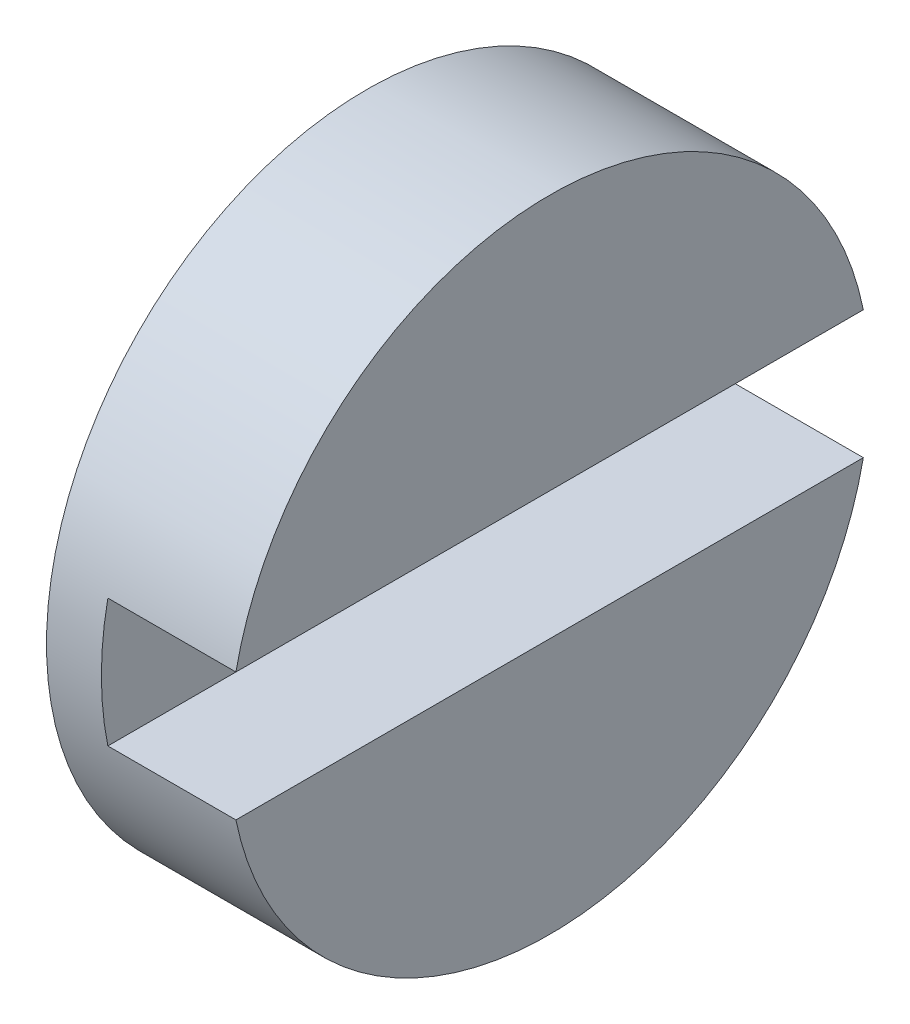
ISO-10303-21;
HEADER;
FILE_DESCRIPTION(('STEP AP214'),'2;1');
FILE_NAME('part.step','',(''),(''),'','','');
FILE_SCHEMA(('AUTOMOTIVE_DESIGN { 1 0 10303 214 1 1 1 1 }'));
ENDSEC;
DATA;
#1=APPLICATION_CONTEXT('core data for automotive mechanical design processes');
#2=APPLICATION_PROTOCOL_DEFINITION('international standard','automotive_design',2000,#1);
#3=PRODUCT_CONTEXT('',#1,'mechanical');
#4=PRODUCT('Part','Part','',(#3));
#5=PRODUCT_RELATED_PRODUCT_CATEGORY('part','',(#4));
#6=PRODUCT_DEFINITION_FORMATION('','',#4);
#7=PRODUCT_DEFINITION_CONTEXT('part definition',#1,'design');
#8=PRODUCT_DEFINITION('design','',#6,#7);
#9=PRODUCT_DEFINITION_SHAPE('','',#8);
#10=(LENGTH_UNIT() NAMED_UNIT(*) SI_UNIT(.MILLI.,.METRE.));
#11=(NAMED_UNIT(*) PLANE_ANGLE_UNIT() SI_UNIT($,.RADIAN.));
#12=(NAMED_UNIT(*) SI_UNIT($,.STERADIAN.) SOLID_ANGLE_UNIT());
#13=UNCERTAINTY_MEASURE_WITH_UNIT(LENGTH_MEASURE(1.E-05),#10,'distance_accuracy_value','');
#14=(GEOMETRIC_REPRESENTATION_CONTEXT(3) GLOBAL_UNCERTAINTY_ASSIGNED_CONTEXT((#13)) GLOBAL_UNIT_ASSIGNED_CONTEXT((#10,
#11,#12)) REPRESENTATION_CONTEXT('',''));
#15=CARTESIAN_POINT('',(0.,0.,0.));
#16=DIRECTION('',(0.,0.,1.));
#17=DIRECTION('',(1.,0.,0.));
#18=AXIS2_PLACEMENT_3D('',#15,#16,#17);
#19=CARTESIAN_POINT('',(6.53712741019333,0.,0.));
#20=DIRECTION('',(1.,0.,0.));
#21=DIRECTION('',(0.,0.,-1.));
#22=AXIS2_PLACEMENT_3D('',#19,#20,#21);
#23=PLANE('',#22);
#24=DIRECTION('',(0.,0.,1.));
#25=VECTOR('',#24,1.);
#26=CARTESIAN_POINT('',(6.53712741019333,79.3831456085717,5.8195900025507));
#27=LINE('',#26,#25);
#28=CARTESIAN_POINT('',(6.53712741019333,79.3831456085717,2.18535718005179));
#29=VERTEX_POINT('',#28);
#30=CARTESIAN_POINT('',(6.53712741019333,79.3831456085717,5.61464281994823));
#31=VERTEX_POINT('',#30);
#32=EDGE_CURVE('E81',#29,#31,#27,.T.);
#33=ORIENTED_EDGE('',*,*,#32,.T.);
#34=CARTESIAN_POINT('',(6.53712741019334,79.0331456085717,3.90000000000001));
#35=DIRECTION('',(1.,0.,0.));
#36=DIRECTION('',(0.,0.,-1.));
#37=AXIS2_PLACEMENT_3D('',#34,#35,#36);
#38=CIRCLE('',#37,1.75);
#39=CARTESIAN_POINT('',(6.53712741019334,78.6831456085717,5.61464281994823));
#40=VERTEX_POINT('',#39);
#41=EDGE_CURVE('E61',#31,#40,#38,.T.);
#42=ORIENTED_EDGE('',*,*,#41,.T.);
#43=DIRECTION('',(0.,0.,1.));
#44=VECTOR('',#43,1.);
#45=CARTESIAN_POINT('',(6.53712741019334,78.6831456085717,5.8195900025507));
#46=LINE('',#45,#44);
#47=CARTESIAN_POINT('',(6.53712741019333,78.6831456085717,2.18535718005178));
#48=VERTEX_POINT('',#47);
#49=EDGE_CURVE('E64',#40,#48,#46,.F.);
#50=ORIENTED_EDGE('',*,*,#49,.T.);
#51=CARTESIAN_POINT('',(6.53712741019333,79.0331456085717,3.90000000000001));
#52=DIRECTION('',(1.,0.,0.));
#53=DIRECTION('',(0.,0.,-1.));
#54=AXIS2_PLACEMENT_3D('',#51,#52,#53);
#55=CIRCLE('',#54,1.75);
#56=EDGE_CURVE('E20',#48,#29,#55,.T.);
#57=ORIENTED_EDGE('',*,*,#56,.T.);
#58=EDGE_LOOP('',(#33,#42,#50,#57));
#59=FACE_BOUND('',#58,.T.);
#60=ADVANCED_FACE('F17',(#59),#23,.T.);
#61=CARTESIAN_POINT('',(6.53712741019334,79.3831456085717,5.8195900025507));
#62=DIRECTION('',(0.,1.,0.));
#63=DIRECTION('',(-1.,0.,0.));
#64=AXIS2_PLACEMENT_3D('',#61,#62,#63);
#65=PLANE('',#64);
#66=DIRECTION('',(-1.,0.,0.));
#67=VECTOR('',#66,1.);
#68=CARTESIAN_POINT('',(6.53712741019334,79.3831456085717,5.61464281994823));
#69=LINE('',#68,#67);
#70=CARTESIAN_POINT('',(7.23712741019334,79.3831456085717,5.61464281994823));
#71=VERTEX_POINT('',#70);
#72=EDGE_CURVE('E79',#31,#71,#69,.F.);
#73=ORIENTED_EDGE('',*,*,#72,.F.);
#74=ORIENTED_EDGE('',*,*,#32,.F.);
#75=DIRECTION('',(-1.,0.,0.));
#76=VECTOR('',#75,1.);
#77=CARTESIAN_POINT('',(6.53712741019334,79.3831456085717,2.18535718005179));
#78=LINE('',#77,#76);
#79=CARTESIAN_POINT('',(7.23712741019334,79.3831456085717,2.18535718005179));
#80=VERTEX_POINT('',#79);
#81=EDGE_CURVE('E57',#80,#29,#78,.T.);
#82=ORIENTED_EDGE('',*,*,#81,.F.);
#83=DIRECTION('',(0.,0.,-1.));
#84=VECTOR('',#83,1.);
#85=CARTESIAN_POINT('',(7.23712741019334,79.3831456085717,3.90000000000001));
#86=LINE('',#85,#84);
#87=EDGE_CURVE('E72',#71,#80,#86,.T.);
#88=ORIENTED_EDGE('',*,*,#87,.F.);
#89=EDGE_LOOP('',(#73,#74,#82,#88));
#90=FACE_BOUND('',#89,.T.);
#91=ADVANCED_FACE('F93',(#90),#65,.F.);
#92=CARTESIAN_POINT('',(6.53712741019334,78.6831456085717,5.8195900025507));
#93=DIRECTION('',(0.,-1.,0.));
#94=DIRECTION('',(1.,0.,0.));
#95=AXIS2_PLACEMENT_3D('',#92,#93,#94);
#96=PLANE('',#95);
#97=DIRECTION('',(1.,0.,0.));
#98=VECTOR('',#97,1.);
#99=CARTESIAN_POINT('',(6.53712741019334,78.6831456085717,2.18535718005178));
#100=LINE('',#99,#98);
#101=CARTESIAN_POINT('',(7.23712741019334,78.6831456085717,2.18535718005178));
#102=VERTEX_POINT('',#101);
#103=EDGE_CURVE('E34',#48,#102,#100,.T.);
#104=ORIENTED_EDGE('',*,*,#103,.F.);
#105=ORIENTED_EDGE('',*,*,#49,.F.);
#106=DIRECTION('',(1.,0.,0.));
#107=VECTOR('',#106,1.);
#108=CARTESIAN_POINT('',(6.53712741019334,78.6831456085717,5.61464281994823));
#109=LINE('',#108,#107);
#110=CARTESIAN_POINT('',(7.23712741019334,78.6831456085717,5.61464281994823));
#111=VERTEX_POINT('',#110);
#112=EDGE_CURVE('E66',#111,#40,#109,.F.);
#113=ORIENTED_EDGE('',*,*,#112,.F.);
#114=DIRECTION('',(0.,0.,-1.));
#115=VECTOR('',#114,1.);
#116=CARTESIAN_POINT('',(7.23712741019334,78.6831456085717,3.90000000000001));
#117=LINE('',#116,#115);
#118=EDGE_CURVE('E70',#102,#111,#117,.F.);
#119=ORIENTED_EDGE('',*,*,#118,.F.);
#120=EDGE_LOOP('',(#104,#105,#113,#119));
#121=FACE_BOUND('',#120,.T.);
#122=ADVANCED_FACE('F68',(#121),#96,.F.);
#123=CARTESIAN_POINT('',(6.23712741019334,79.0331456085717,3.90000000000001));
#124=DIRECTION('',(1.,0.,0.));
#125=DIRECTION('',(0.,0.,-1.));
#126=AXIS2_PLACEMENT_3D('',#123,#124,#125);
#127=PLANE('',#126);
#128=CARTESIAN_POINT('',(6.23712741019334,79.0331456085717,3.90000000000001));
#129=DIRECTION('',(1.,0.,0.));
#130=DIRECTION('',(0.,0.,-1.));
#131=AXIS2_PLACEMENT_3D('',#128,#129,#130);
#132=CIRCLE('',#131,1.75);
#133=CARTESIAN_POINT('',(6.23712741019334,79.0331456085717,2.15000000000001));
#134=VERTEX_POINT('',#133);
#135=EDGE_CURVE('E85',#134,#134,#132,.T.);
#136=ORIENTED_EDGE('',*,*,#135,.F.);
#137=EDGE_LOOP('',(#136));
#138=FACE_BOUND('',#137,.T.);
#139=ADVANCED_FACE('F98',(#138),#127,.F.);
#140=CARTESIAN_POINT('',(7.23712741019334,79.0331456085717,3.90000000000001));
#141=DIRECTION('',(1.,0.,0.));
#142=DIRECTION('',(0.,0.,-1.));
#143=AXIS2_PLACEMENT_3D('',#140,#141,#142);
#144=PLANE('',#143);
#145=ORIENTED_EDGE('',*,*,#87,.T.);
#146=CARTESIAN_POINT('',(7.23712741019334,79.0331456085717,3.90000000000001));
#147=DIRECTION('',(1.,0.,0.));
#148=DIRECTION('',(0.,0.,-1.));
#149=AXIS2_PLACEMENT_3D('',#146,#147,#148);
#150=CIRCLE('',#149,1.75);
#151=EDGE_CURVE('E26',#71,#80,#150,.F.);
#152=ORIENTED_EDGE('',*,*,#151,.F.);
#153=EDGE_LOOP('',(#145,#152));
#154=FACE_BOUND('',#153,.T.);
#155=ADVANCED_FACE('F96',(#154),#144,.T.);
#156=CARTESIAN_POINT('',(7.23712741019334,79.0331456085717,3.90000000000001));
#157=DIRECTION('',(1.,0.,0.));
#158=DIRECTION('',(0.,0.,-1.));
#159=AXIS2_PLACEMENT_3D('',#156,#157,#158);
#160=PLANE('',#159);
#161=ORIENTED_EDGE('',*,*,#118,.T.);
#162=CARTESIAN_POINT('',(7.23712741019334,79.0331456085717,3.90000000000001));
#163=DIRECTION('',(1.,0.,0.));
#164=DIRECTION('',(0.,0.,-1.));
#165=AXIS2_PLACEMENT_3D('',#162,#163,#164);
#166=CIRCLE('',#165,1.75);
#167=EDGE_CURVE('E11',#102,#111,#166,.F.);
#168=ORIENTED_EDGE('',*,*,#167,.F.);
#169=EDGE_LOOP('',(#161,#168));
#170=FACE_BOUND('',#169,.T.);
#171=ADVANCED_FACE('F89',(#170),#160,.T.);
#172=CARTESIAN_POINT('',(6.23712741019334,79.0331456085717,3.90000000000001));
#173=DIRECTION('',(1.,0.,0.));
#174=DIRECTION('',(0.,0.,-1.));
#175=AXIS2_PLACEMENT_3D('',#172,#173,#174);
#176=CYLINDRICAL_SURFACE('',#175,1.75);
#177=ORIENTED_EDGE('',*,*,#103,.T.);
#178=ORIENTED_EDGE('',*,*,#167,.T.);
#179=ORIENTED_EDGE('',*,*,#112,.T.);
#180=ORIENTED_EDGE('',*,*,#41,.F.);
#181=ORIENTED_EDGE('',*,*,#72,.T.);
#182=ORIENTED_EDGE('',*,*,#151,.T.);
#183=ORIENTED_EDGE('',*,*,#81,.T.);
#184=ORIENTED_EDGE('',*,*,#56,.F.);
#185=EDGE_LOOP('',(#177,#178,#179,#180,#181,#182,#183,#184));
#186=FACE_BOUND('',#185,.T.);
#187=ORIENTED_EDGE('',*,*,#135,.T.);
#188=EDGE_LOOP('',(#187));
#189=FACE_BOUND('',#188,.T.);
#190=ADVANCED_FACE('F54',(#186,#189),#176,.T.);
#191=CLOSED_SHELL('',(#60,#91,#122,#139,#155,#171,#190));
#192=MANIFOLD_SOLID_BREP('B1',#191);
#193=ADVANCED_BREP_SHAPE_REPRESENTATION('',(#18,#192),#14);
#194=SHAPE_DEFINITION_REPRESENTATION(#9,#193);
ENDSEC;
END-ISO-10303-21;
